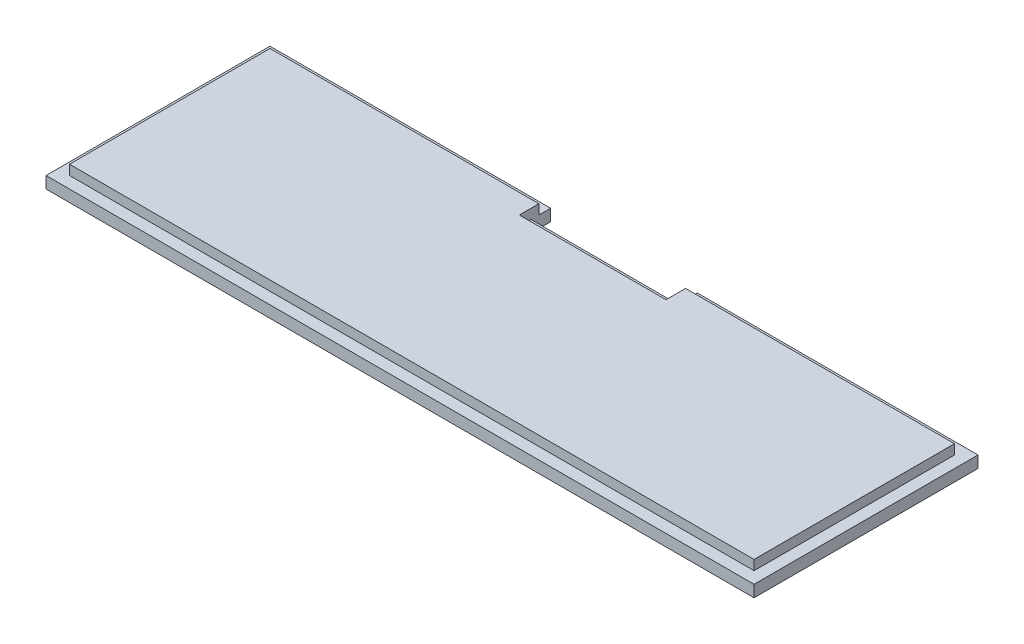
ISO-10303-21;
HEADER;
FILE_DESCRIPTION(('STEP AP214'),'2;1');
FILE_NAME('part.step','',(''),(''),'','','');
FILE_SCHEMA(('AUTOMOTIVE_DESIGN { 1 0 10303 214 1 1 1 1 }'));
ENDSEC;
DATA;
#1=APPLICATION_CONTEXT('core data for automotive mechanical design processes');
#2=APPLICATION_PROTOCOL_DEFINITION('international standard','automotive_design',2000,#1);
#3=PRODUCT_CONTEXT('',#1,'mechanical');
#4=PRODUCT('Part','Part','',(#3));
#5=PRODUCT_RELATED_PRODUCT_CATEGORY('part','',(#4));
#6=PRODUCT_DEFINITION_FORMATION('','',#4);
#7=PRODUCT_DEFINITION_CONTEXT('part definition',#1,'design');
#8=PRODUCT_DEFINITION('design','',#6,#7);
#9=PRODUCT_DEFINITION_SHAPE('','',#8);
#10=(LENGTH_UNIT() NAMED_UNIT(*) SI_UNIT(.MILLI.,.METRE.));
#11=(NAMED_UNIT(*) PLANE_ANGLE_UNIT() SI_UNIT($,.RADIAN.));
#12=(NAMED_UNIT(*) SI_UNIT($,.STERADIAN.) SOLID_ANGLE_UNIT());
#13=UNCERTAINTY_MEASURE_WITH_UNIT(LENGTH_MEASURE(1.E-05),#10,'distance_accuracy_value','');
#14=(GEOMETRIC_REPRESENTATION_CONTEXT(3) GLOBAL_UNCERTAINTY_ASSIGNED_CONTEXT((#13)) GLOBAL_UNIT_ASSIGNED_CONTEXT((#10,
#11,#12)) REPRESENTATION_CONTEXT('',''));
#15=CARTESIAN_POINT('',(0.,0.,0.));
#16=DIRECTION('',(0.,0.,1.));
#17=DIRECTION('',(1.,0.,0.));
#18=AXIS2_PLACEMENT_3D('',#15,#16,#17);
#19=CARTESIAN_POINT('',(28.7,-7.8,-20.9));
#20=DIRECTION('',(0.,0.,1.));
#21=DIRECTION('',(1.,0.,0.));
#22=AXIS2_PLACEMENT_3D('',#19,#20,#21);
#23=PLANE('',#22);
#24=DIRECTION('',(-1.,0.,0.));
#25=VECTOR('',#24,1.);
#26=CARTESIAN_POINT('',(28.7,1.2,-20.9));
#27=LINE('',#26,#25);
#28=CARTESIAN_POINT('',(43.7,1.2,-20.9));
#29=VERTEX_POINT('',#28);
#30=CARTESIAN_POINT('',(28.7,1.2,-20.9));
#31=VERTEX_POINT('',#30);
#32=EDGE_CURVE('E166',#29,#31,#27,.T.);
#33=ORIENTED_EDGE('',*,*,#32,.F.);
#34=DIRECTION('',(0.,1.,0.));
#35=VECTOR('',#34,1.);
#36=CARTESIAN_POINT('',(43.7,-7.8,-20.9));
#37=LINE('',#36,#35);
#38=CARTESIAN_POINT('',(43.7,0.,-20.9));
#39=VERTEX_POINT('',#38);
#40=EDGE_CURVE('E199',#39,#29,#37,.T.);
#41=ORIENTED_EDGE('',*,*,#40,.F.);
#42=DIRECTION('',(-1.,0.,0.));
#43=VECTOR('',#42,1.);
#44=CARTESIAN_POINT('',(0.,0.,-20.9));
#45=LINE('',#44,#43);
#46=CARTESIAN_POINT('',(28.7,0.,-20.9));
#47=VERTEX_POINT('',#46);
#48=EDGE_CURVE('E194',#39,#47,#45,.T.);
#49=ORIENTED_EDGE('',*,*,#48,.T.);
#50=DIRECTION('',(0.,1.,0.));
#51=VECTOR('',#50,1.);
#52=CARTESIAN_POINT('',(28.7,-7.8,-20.9));
#53=LINE('',#52,#51);
#54=EDGE_CURVE('E190',#47,#31,#53,.T.);
#55=ORIENTED_EDGE('',*,*,#54,.T.);
#56=EDGE_LOOP('',(#33,#41,#49,#55));
#57=FACE_BOUND('',#56,.T.);
#58=ADVANCED_FACE('F38',(#57),#23,.F.);
#59=CARTESIAN_POINT('',(0.,1.2,-22.9));
#60=DIRECTION('',(0.,0.,1.));
#61=DIRECTION('',(1.,0.,0.));
#62=AXIS2_PLACEMENT_3D('',#59,#60,#61);
#63=PLANE('',#62);
#64=DIRECTION('',(-1.,0.,0.));
#65=VECTOR('',#64,1.);
#66=CARTESIAN_POINT('',(0.,1.2,-22.9));
#67=LINE('',#66,#65);
#68=CARTESIAN_POINT('',(28.7,1.2,-22.9));
#69=VERTEX_POINT('',#68);
#70=CARTESIAN_POINT('',(0.,1.2,-22.9));
#71=VERTEX_POINT('',#70);
#72=EDGE_CURVE('E287',#69,#71,#67,.T.);
#73=ORIENTED_EDGE('',*,*,#72,.F.);
#74=DIRECTION('',(0.,1.,0.));
#75=VECTOR('',#74,1.);
#76=CARTESIAN_POINT('',(28.7,-7.8,-22.9));
#77=LINE('',#76,#75);
#78=CARTESIAN_POINT('',(28.7,0.,-22.9));
#79=VERTEX_POINT('',#78);
#80=EDGE_CURVE('E191',#79,#69,#77,.T.);
#81=ORIENTED_EDGE('',*,*,#80,.F.);
#82=DIRECTION('',(-1.,0.,0.));
#83=VECTOR('',#82,1.);
#84=CARTESIAN_POINT('',(0.,0.,-22.9));
#85=LINE('',#84,#83);
#86=CARTESIAN_POINT('',(0.,0.,-22.9));
#87=VERTEX_POINT('',#86);
#88=EDGE_CURVE('E302',#79,#87,#85,.T.);
#89=ORIENTED_EDGE('',*,*,#88,.T.);
#90=DIRECTION('',(0.,-1.,0.));
#91=VECTOR('',#90,1.);
#92=CARTESIAN_POINT('',(0.,1.2,-22.9));
#93=LINE('',#92,#91);
#94=EDGE_CURVE('E292',#71,#87,#93,.T.);
#95=ORIENTED_EDGE('',*,*,#94,.F.);
#96=EDGE_LOOP('',(#73,#81,#89,#95));
#97=FACE_BOUND('',#96,.T.);
#98=ADVANCED_FACE('F346',(#97),#63,.F.);
#99=CARTESIAN_POINT('',(1.2,2.2,-21.7));
#100=DIRECTION('',(0.,0.,1.));
#101=DIRECTION('',(1.,0.,0.));
#102=AXIS2_PLACEMENT_3D('',#99,#100,#101);
#103=PLANE('',#102);
#104=DIRECTION('',(-1.,0.,0.));
#105=VECTOR('',#104,1.);
#106=CARTESIAN_POINT('',(1.2,2.2,-21.7));
#107=LINE('',#106,#105);
#108=CARTESIAN_POINT('',(28.7,2.2,-21.7));
#109=VERTEX_POINT('',#108);
#110=CARTESIAN_POINT('',(1.2,2.2,-21.7));
#111=VERTEX_POINT('',#110);
#112=EDGE_CURVE('E240',#109,#111,#107,.T.);
#113=ORIENTED_EDGE('',*,*,#112,.F.);
#114=DIRECTION('',(0.,-1.,0.));
#115=VECTOR('',#114,1.);
#116=CARTESIAN_POINT('',(28.7,2.2,-21.7));
#117=LINE('',#116,#115);
#118=CARTESIAN_POINT('',(28.7,1.2,-21.7));
#119=VERTEX_POINT('',#118);
#120=EDGE_CURVE('E218',#109,#119,#117,.T.);
#121=ORIENTED_EDGE('',*,*,#120,.T.);
#122=DIRECTION('',(-1.,0.,0.));
#123=VECTOR('',#122,1.);
#124=CARTESIAN_POINT('',(1.2,1.2,-21.7));
#125=LINE('',#124,#123);
#126=CARTESIAN_POINT('',(1.2,1.2,-21.7));
#127=VERTEX_POINT('',#126);
#128=EDGE_CURVE('E62',#119,#127,#125,.T.);
#129=ORIENTED_EDGE('',*,*,#128,.T.);
#130=DIRECTION('',(0.,-1.,0.));
#131=VECTOR('',#130,1.);
#132=CARTESIAN_POINT('',(1.2,2.2,-21.7));
#133=LINE('',#132,#131);
#134=EDGE_CURVE('E245',#111,#127,#133,.T.);
#135=ORIENTED_EDGE('',*,*,#134,.F.);
#136=EDGE_LOOP('',(#113,#121,#129,#135));
#137=FACE_BOUND('',#136,.T.);
#138=ADVANCED_FACE('F355',(#137),#103,.F.);
#139=CARTESIAN_POINT('',(0.,1.2,0.));
#140=DIRECTION('',(0.,-1.,0.));
#141=DIRECTION('',(0.,0.,-1.));
#142=AXIS2_PLACEMENT_3D('',#139,#140,#141);
#143=PLANE('',#142);
#144=ORIENTED_EDGE('',*,*,#128,.F.);
#145=DIRECTION('',(0.,0.,-1.));
#146=VECTOR('',#145,1.);
#147=CARTESIAN_POINT('',(28.7,1.2,0.));
#148=LINE('',#147,#146);
#149=EDGE_CURVE('E221',#119,#69,#148,.T.);
#150=ORIENTED_EDGE('',*,*,#149,.T.);
#151=ORIENTED_EDGE('',*,*,#72,.T.);
#152=DIRECTION('',(0.,0.,1.));
#153=VECTOR('',#152,1.);
#154=CARTESIAN_POINT('',(0.,1.2,0.));
#155=LINE('',#154,#153);
#156=CARTESIAN_POINT('',(0.,1.2,0.));
#157=VERTEX_POINT('',#156);
#158=EDGE_CURVE('E276',#71,#157,#155,.T.);
#159=ORIENTED_EDGE('',*,*,#158,.T.);
#160=DIRECTION('',(1.,0.,0.));
#161=VECTOR('',#160,1.);
#162=CARTESIAN_POINT('',(0.,1.2,0.));
#163=LINE('',#162,#161);
#164=CARTESIAN_POINT('',(72.4,1.2,0.));
#165=VERTEX_POINT('',#164);
#166=EDGE_CURVE('E280',#157,#165,#163,.T.);
#167=ORIENTED_EDGE('',*,*,#166,.T.);
#168=DIRECTION('',(0.,0.,-1.));
#169=VECTOR('',#168,1.);
#170=CARTESIAN_POINT('',(72.4,1.2,0.));
#171=LINE('',#170,#169);
#172=CARTESIAN_POINT('',(72.4,1.2,-22.9));
#173=VERTEX_POINT('',#172);
#174=EDGE_CURVE('E284',#165,#173,#171,.T.);
#175=ORIENTED_EDGE('',*,*,#174,.T.);
#176=CARTESIAN_POINT('',(43.7,1.2,-22.9));
#177=VERTEX_POINT('',#176);
#178=EDGE_CURVE('E288',#173,#177,#67,.T.);
#179=ORIENTED_EDGE('',*,*,#178,.T.);
#180=DIRECTION('',(0.,0.,1.));
#181=VECTOR('',#180,1.);
#182=CARTESIAN_POINT('',(43.7,1.2,0.));
#183=LINE('',#182,#181);
#184=CARTESIAN_POINT('',(43.7,1.2,-21.7));
#185=VERTEX_POINT('',#184);
#186=EDGE_CURVE('E211',#177,#185,#183,.T.);
#187=ORIENTED_EDGE('',*,*,#186,.T.);
#188=CARTESIAN_POINT('',(71.2,1.2,-21.7));
#189=VERTEX_POINT('',#188);
#190=EDGE_CURVE('E234',#189,#185,#125,.T.);
#191=ORIENTED_EDGE('',*,*,#190,.F.);
#192=DIRECTION('',(0.,0.,-1.));
#193=VECTOR('',#192,1.);
#194=CARTESIAN_POINT('',(71.2,1.2,-21.7));
#195=LINE('',#194,#193);
#196=CARTESIAN_POINT('',(71.2,1.2,-1.2));
#197=VERTEX_POINT('',#196);
#198=EDGE_CURVE('E253',#197,#189,#195,.T.);
#199=ORIENTED_EDGE('',*,*,#198,.F.);
#200=DIRECTION('',(1.,0.,0.));
#201=VECTOR('',#200,1.);
#202=CARTESIAN_POINT('',(1.2,1.2,-1.2));
#203=LINE('',#202,#201);
#204=CARTESIAN_POINT('',(1.2,1.2,-1.2));
#205=VERTEX_POINT('',#204);
#206=EDGE_CURVE('E249',#205,#197,#203,.T.);
#207=ORIENTED_EDGE('',*,*,#206,.F.);
#208=DIRECTION('',(0.,0.,1.));
#209=VECTOR('',#208,1.);
#210=CARTESIAN_POINT('',(1.2,1.2,-21.7));
#211=LINE('',#210,#209);
#212=EDGE_CURVE('E228',#127,#205,#211,.T.);
#213=ORIENTED_EDGE('',*,*,#212,.F.);
#214=EDGE_LOOP('',(#144,#150,#151,#159,#167,#175,#179,#187,#191,#199,#207,#213));
#215=FACE_BOUND('',#214,.T.);
#216=ADVANCED_FACE('F341',(#215),#143,.F.);
#217=CARTESIAN_POINT('',(0.,1.2,0.));
#218=DIRECTION('',(1.,0.,0.));
#219=DIRECTION('',(0.,0.,-1.));
#220=AXIS2_PLACEMENT_3D('',#217,#218,#219);
#221=PLANE('',#220);
#222=DIRECTION('',(0.,0.,1.));
#223=VECTOR('',#222,1.);
#224=CARTESIAN_POINT('',(0.,0.,0.));
#225=LINE('',#224,#223);
#226=CARTESIAN_POINT('',(0.,0.,0.));
#227=VERTEX_POINT('',#226);
#228=EDGE_CURVE('E275',#87,#227,#225,.T.);
#229=ORIENTED_EDGE('',*,*,#228,.T.);
#230=DIRECTION('',(0.,-1.,0.));
#231=VECTOR('',#230,1.);
#232=CARTESIAN_POINT('',(0.,1.2,0.));
#233=LINE('',#232,#231);
#234=EDGE_CURVE('E47',#157,#227,#233,.T.);
#235=ORIENTED_EDGE('',*,*,#234,.F.);
#236=ORIENTED_EDGE('',*,*,#158,.F.);
#237=ORIENTED_EDGE('',*,*,#94,.T.);
#238=EDGE_LOOP('',(#229,#235,#236,#237));
#239=FACE_BOUND('',#238,.T.);
#240=ADVANCED_FACE('F40',(#239),#221,.F.);
#241=CARTESIAN_POINT('',(0.,1.2,0.));
#242=DIRECTION('',(0.,0.,-1.));
#243=DIRECTION('',(-1.,0.,0.));
#244=AXIS2_PLACEMENT_3D('',#241,#242,#243);
#245=PLANE('',#244);
#246=DIRECTION('',(1.,0.,0.));
#247=VECTOR('',#246,1.);
#248=CARTESIAN_POINT('',(0.,0.,0.));
#249=LINE('',#248,#247);
#250=CARTESIAN_POINT('',(72.4,0.,0.));
#251=VERTEX_POINT('',#250);
#252=EDGE_CURVE('E296',#227,#251,#249,.T.);
#253=ORIENTED_EDGE('',*,*,#252,.T.);
#254=DIRECTION('',(0.,-1.,0.));
#255=VECTOR('',#254,1.);
#256=CARTESIAN_POINT('',(72.4,1.2,0.));
#257=LINE('',#256,#255);
#258=EDGE_CURVE('E313',#165,#251,#257,.T.);
#259=ORIENTED_EDGE('',*,*,#258,.F.);
#260=ORIENTED_EDGE('',*,*,#166,.F.);
#261=ORIENTED_EDGE('',*,*,#234,.T.);
#262=EDGE_LOOP('',(#253,#259,#260,#261));
#263=FACE_BOUND('',#262,.T.);
#264=ADVANCED_FACE('F320',(#263),#245,.F.);
#265=CARTESIAN_POINT('',(72.4,1.2,0.));
#266=DIRECTION('',(-1.,0.,0.));
#267=DIRECTION('',(0.,0.,1.));
#268=AXIS2_PLACEMENT_3D('',#265,#266,#267);
#269=PLANE('',#268);
#270=DIRECTION('',(0.,0.,-1.));
#271=VECTOR('',#270,1.);
#272=CARTESIAN_POINT('',(72.4,0.,0.));
#273=LINE('',#272,#271);
#274=CARTESIAN_POINT('',(72.4,0.,-22.9));
#275=VERTEX_POINT('',#274);
#276=EDGE_CURVE('E299',#251,#275,#273,.T.);
#277=ORIENTED_EDGE('',*,*,#276,.T.);
#278=DIRECTION('',(0.,-1.,0.));
#279=VECTOR('',#278,1.);
#280=CARTESIAN_POINT('',(72.4,1.2,-22.9));
#281=LINE('',#280,#279);
#282=EDGE_CURVE('E309',#173,#275,#281,.T.);
#283=ORIENTED_EDGE('',*,*,#282,.F.);
#284=ORIENTED_EDGE('',*,*,#174,.F.);
#285=ORIENTED_EDGE('',*,*,#258,.T.);
#286=EDGE_LOOP('',(#277,#283,#284,#285));
#287=FACE_BOUND('',#286,.T.);
#288=ADVANCED_FACE('F335',(#287),#269,.F.);
#289=CARTESIAN_POINT('',(43.7,0.,-22.9));
#290=VERTEX_POINT('',#289);
#291=EDGE_CURVE('E281',#275,#290,#85,.T.);
#292=ORIENTED_EDGE('',*,*,#291,.T.);
#293=DIRECTION('',(0.,1.,0.));
#294=VECTOR('',#293,1.);
#295=CARTESIAN_POINT('',(43.7,-7.8,-22.9));
#296=LINE('',#295,#294);
#297=EDGE_CURVE('E195',#290,#177,#296,.T.);
#298=ORIENTED_EDGE('',*,*,#297,.T.);
#299=ORIENTED_EDGE('',*,*,#178,.F.);
#300=ORIENTED_EDGE('',*,*,#282,.T.);
#301=EDGE_LOOP('',(#292,#298,#299,#300));
#302=FACE_BOUND('',#301,.T.);
#303=ADVANCED_FACE('F339',(#302),#63,.F.);
#304=CARTESIAN_POINT('',(0.,0.,0.));
#305=DIRECTION('',(0.,-1.,0.));
#306=DIRECTION('',(0.,0.,-1.));
#307=AXIS2_PLACEMENT_3D('',#304,#305,#306);
#308=PLANE('',#307);
#309=DIRECTION('',(0.,0.,-1.));
#310=VECTOR('',#309,1.);
#311=CARTESIAN_POINT('',(28.7,0.,0.));
#312=LINE('',#311,#310);
#313=EDGE_CURVE('E225',#47,#79,#312,.T.);
#314=ORIENTED_EDGE('',*,*,#313,.F.);
#315=ORIENTED_EDGE('',*,*,#48,.F.);
#316=DIRECTION('',(0.,0.,1.));
#317=VECTOR('',#316,1.);
#318=CARTESIAN_POINT('',(43.7,0.,0.));
#319=LINE('',#318,#317);
#320=EDGE_CURVE('E215',#290,#39,#319,.T.);
#321=ORIENTED_EDGE('',*,*,#320,.F.);
#322=ORIENTED_EDGE('',*,*,#291,.F.);
#323=ORIENTED_EDGE('',*,*,#276,.F.);
#324=ORIENTED_EDGE('',*,*,#252,.F.);
#325=ORIENTED_EDGE('',*,*,#228,.F.);
#326=ORIENTED_EDGE('',*,*,#88,.F.);
#327=EDGE_LOOP('',(#314,#315,#321,#322,#323,#324,#325,#326));
#328=FACE_BOUND('',#327,.T.);
#329=ADVANCED_FACE('F329',(#328),#308,.T.);
#330=CARTESIAN_POINT('',(1.2,2.2,-21.7));
#331=DIRECTION('',(1.,0.,0.));
#332=DIRECTION('',(0.,0.,-1.));
#333=AXIS2_PLACEMENT_3D('',#330,#331,#332);
#334=PLANE('',#333);
#335=ORIENTED_EDGE('',*,*,#212,.T.);
#336=DIRECTION('',(0.,-1.,0.));
#337=VECTOR('',#336,1.);
#338=CARTESIAN_POINT('',(1.2,2.2,-1.2));
#339=LINE('',#338,#337);
#340=CARTESIAN_POINT('',(1.2,2.2,-1.2));
#341=VERTEX_POINT('',#340);
#342=EDGE_CURVE('E271',#341,#205,#339,.T.);
#343=ORIENTED_EDGE('',*,*,#342,.F.);
#344=DIRECTION('',(0.,0.,1.));
#345=VECTOR('',#344,1.);
#346=CARTESIAN_POINT('',(1.2,2.2,-21.7));
#347=LINE('',#346,#345);
#348=EDGE_CURVE('E229',#111,#341,#347,.T.);
#349=ORIENTED_EDGE('',*,*,#348,.F.);
#350=ORIENTED_EDGE('',*,*,#134,.T.);
#351=EDGE_LOOP('',(#335,#343,#349,#350));
#352=FACE_BOUND('',#351,.T.);
#353=ADVANCED_FACE('F357',(#352),#334,.F.);
#354=CARTESIAN_POINT('',(1.2,2.2,-1.2));
#355=DIRECTION('',(0.,0.,-1.));
#356=DIRECTION('',(-1.,0.,0.));
#357=AXIS2_PLACEMENT_3D('',#354,#355,#356);
#358=PLANE('',#357);
#359=ORIENTED_EDGE('',*,*,#206,.T.);
#360=DIRECTION('',(0.,-1.,0.));
#361=VECTOR('',#360,1.);
#362=CARTESIAN_POINT('',(71.2,2.2,-1.2));
#363=LINE('',#362,#361);
#364=CARTESIAN_POINT('',(71.2,2.2,-1.2));
#365=VERTEX_POINT('',#364);
#366=EDGE_CURVE('E267',#365,#197,#363,.T.);
#367=ORIENTED_EDGE('',*,*,#366,.F.);
#368=DIRECTION('',(1.,0.,0.));
#369=VECTOR('',#368,1.);
#370=CARTESIAN_POINT('',(1.2,2.2,-1.2));
#371=LINE('',#370,#369);
#372=EDGE_CURVE('E233',#341,#365,#371,.T.);
#373=ORIENTED_EDGE('',*,*,#372,.F.);
#374=ORIENTED_EDGE('',*,*,#342,.T.);
#375=EDGE_LOOP('',(#359,#367,#373,#374));
#376=FACE_BOUND('',#375,.T.);
#377=ADVANCED_FACE('F359',(#376),#358,.F.);
#378=CARTESIAN_POINT('',(71.2,2.2,-21.7));
#379=DIRECTION('',(-1.,0.,0.));
#380=DIRECTION('',(0.,0.,1.));
#381=AXIS2_PLACEMENT_3D('',#378,#379,#380);
#382=PLANE('',#381);
#383=ORIENTED_EDGE('',*,*,#198,.T.);
#384=DIRECTION('',(0.,-1.,0.));
#385=VECTOR('',#384,1.);
#386=CARTESIAN_POINT('',(71.2,2.2,-21.7));
#387=LINE('',#386,#385);
#388=CARTESIAN_POINT('',(71.2,2.2,-21.7));
#389=VERTEX_POINT('',#388);
#390=EDGE_CURVE('E263',#389,#189,#387,.T.);
#391=ORIENTED_EDGE('',*,*,#390,.F.);
#392=DIRECTION('',(0.,0.,-1.));
#393=VECTOR('',#392,1.);
#394=CARTESIAN_POINT('',(71.2,2.2,-21.7));
#395=LINE('',#394,#393);
#396=EDGE_CURVE('E237',#365,#389,#395,.T.);
#397=ORIENTED_EDGE('',*,*,#396,.F.);
#398=ORIENTED_EDGE('',*,*,#366,.T.);
#399=EDGE_LOOP('',(#383,#391,#397,#398));
#400=FACE_BOUND('',#399,.T.);
#401=ADVANCED_FACE('F365',(#400),#382,.F.);
#402=ORIENTED_EDGE('',*,*,#190,.T.);
#403=DIRECTION('',(0.,1.,0.));
#404=VECTOR('',#403,1.);
#405=CARTESIAN_POINT('',(43.7,2.2,-21.7));
#406=LINE('',#405,#404);
#407=CARTESIAN_POINT('',(43.7,2.2,-21.7));
#408=VERTEX_POINT('',#407);
#409=EDGE_CURVE('E207',#185,#408,#406,.T.);
#410=ORIENTED_EDGE('',*,*,#409,.T.);
#411=EDGE_CURVE('E241',#389,#408,#107,.T.);
#412=ORIENTED_EDGE('',*,*,#411,.F.);
#413=ORIENTED_EDGE('',*,*,#390,.T.);
#414=EDGE_LOOP('',(#402,#410,#412,#413));
#415=FACE_BOUND('',#414,.T.);
#416=ADVANCED_FACE('F367',(#415),#103,.F.);
#417=CARTESIAN_POINT('',(0.,2.2,0.));
#418=DIRECTION('',(0.,1.,0.));
#419=DIRECTION('',(0.,0.,1.));
#420=AXIS2_PLACEMENT_3D('',#417,#418,#419);
#421=PLANE('',#420);
#422=DIRECTION('',(1.,0.,0.));
#423=VECTOR('',#422,1.);
#424=CARTESIAN_POINT('',(28.7,2.2,-19.7));
#425=LINE('',#424,#423);
#426=CARTESIAN_POINT('',(28.7,2.2,-19.7));
#427=VERTEX_POINT('',#426);
#428=CARTESIAN_POINT('',(43.7,2.2,-19.7));
#429=VERTEX_POINT('',#428);
#430=EDGE_CURVE('E176',#427,#429,#425,.T.);
#431=ORIENTED_EDGE('',*,*,#430,.F.);
#432=DIRECTION('',(0.,0.,1.));
#433=VECTOR('',#432,1.);
#434=CARTESIAN_POINT('',(28.7,2.2,0.));
#435=LINE('',#434,#433);
#436=EDGE_CURVE('E11',#109,#427,#435,.T.);
#437=ORIENTED_EDGE('',*,*,#436,.F.);
#438=ORIENTED_EDGE('',*,*,#112,.T.);
#439=ORIENTED_EDGE('',*,*,#348,.T.);
#440=ORIENTED_EDGE('',*,*,#372,.T.);
#441=ORIENTED_EDGE('',*,*,#396,.T.);
#442=ORIENTED_EDGE('',*,*,#411,.T.);
#443=DIRECTION('',(0.,0.,-1.));
#444=VECTOR('',#443,1.);
#445=CARTESIAN_POINT('',(43.7,2.2,-22.9));
#446=LINE('',#445,#444);
#447=EDGE_CURVE('E186',#429,#408,#446,.T.);
#448=ORIENTED_EDGE('',*,*,#447,.F.);
#449=EDGE_LOOP('',(#431,#437,#438,#439,#440,#441,#442,#448));
#450=FACE_BOUND('',#449,.T.);
#451=ADVANCED_FACE('F352',(#450),#421,.T.);
#452=CARTESIAN_POINT('',(28.7,-7.8,-22.9));
#453=DIRECTION('',(-1.,0.,0.));
#454=DIRECTION('',(0.,0.,1.));
#455=AXIS2_PLACEMENT_3D('',#452,#453,#454);
#456=PLANE('',#455);
#457=ORIENTED_EDGE('',*,*,#313,.T.);
#458=ORIENTED_EDGE('',*,*,#80,.T.);
#459=ORIENTED_EDGE('',*,*,#149,.F.);
#460=ORIENTED_EDGE('',*,*,#120,.F.);
#461=ORIENTED_EDGE('',*,*,#436,.T.);
#462=DIRECTION('',(0.,1.,0.));
#463=VECTOR('',#462,1.);
#464=CARTESIAN_POINT('',(28.7,1.2,-19.7));
#465=LINE('',#464,#463);
#466=CARTESIAN_POINT('',(28.7,1.2,-19.7));
#467=VERTEX_POINT('',#466);
#468=EDGE_CURVE('E154',#467,#427,#465,.T.);
#469=ORIENTED_EDGE('',*,*,#468,.F.);
#470=DIRECTION('',(0.,0.,1.));
#471=VECTOR('',#470,1.);
#472=CARTESIAN_POINT('',(28.7,1.2,-20.9));
#473=LINE('',#472,#471);
#474=EDGE_CURVE('E159',#31,#467,#473,.T.);
#475=ORIENTED_EDGE('',*,*,#474,.F.);
#476=ORIENTED_EDGE('',*,*,#54,.F.);
#477=EDGE_LOOP('',(#457,#458,#459,#460,#461,#469,#475,#476));
#478=FACE_BOUND('',#477,.T.);
#479=ADVANCED_FACE('F156',(#478),#456,.F.);
#480=CARTESIAN_POINT('',(43.7,-7.8,-22.9));
#481=DIRECTION('',(1.,0.,0.));
#482=DIRECTION('',(0.,0.,-1.));
#483=AXIS2_PLACEMENT_3D('',#480,#481,#482);
#484=PLANE('',#483);
#485=ORIENTED_EDGE('',*,*,#320,.T.);
#486=ORIENTED_EDGE('',*,*,#40,.T.);
#487=DIRECTION('',(0.,0.,-1.));
#488=VECTOR('',#487,1.);
#489=CARTESIAN_POINT('',(43.7,1.2,-20.9));
#490=LINE('',#489,#488);
#491=CARTESIAN_POINT('',(43.7,1.2,-19.7));
#492=VERTEX_POINT('',#491);
#493=EDGE_CURVE('E54',#492,#29,#490,.T.);
#494=ORIENTED_EDGE('',*,*,#493,.F.);
#495=DIRECTION('',(0.,1.,0.));
#496=VECTOR('',#495,1.);
#497=CARTESIAN_POINT('',(43.7,1.2,-19.7));
#498=LINE('',#497,#496);
#499=EDGE_CURVE('E165',#492,#429,#498,.T.);
#500=ORIENTED_EDGE('',*,*,#499,.T.);
#501=ORIENTED_EDGE('',*,*,#447,.T.);
#502=ORIENTED_EDGE('',*,*,#409,.F.);
#503=ORIENTED_EDGE('',*,*,#186,.F.);
#504=ORIENTED_EDGE('',*,*,#297,.F.);
#505=EDGE_LOOP('',(#485,#486,#494,#500,#501,#502,#503,#504));
#506=FACE_BOUND('',#505,.T.);
#507=ADVANCED_FACE('F369',(#506),#484,.F.);
#508=CARTESIAN_POINT('',(28.7,1.2,-19.7));
#509=DIRECTION('',(0.,0.,1.));
#510=DIRECTION('',(1.,0.,0.));
#511=AXIS2_PLACEMENT_3D('',#508,#509,#510);
#512=PLANE('',#511);
#513=ORIENTED_EDGE('',*,*,#430,.T.);
#514=ORIENTED_EDGE('',*,*,#499,.F.);
#515=DIRECTION('',(1.,0.,0.));
#516=VECTOR('',#515,1.);
#517=CARTESIAN_POINT('',(28.7,1.2,-19.7));
#518=LINE('',#517,#516);
#519=EDGE_CURVE('E168',#467,#492,#518,.T.);
#520=ORIENTED_EDGE('',*,*,#519,.F.);
#521=ORIENTED_EDGE('',*,*,#468,.T.);
#522=EDGE_LOOP('',(#513,#514,#520,#521));
#523=FACE_BOUND('',#522,.T.);
#524=ADVANCED_FACE('F169',(#523),#512,.F.);
#525=CARTESIAN_POINT('',(0.,1.2,0.));
#526=DIRECTION('',(0.,1.,0.));
#527=DIRECTION('',(0.,0.,1.));
#528=AXIS2_PLACEMENT_3D('',#525,#526,#527);
#529=PLANE('',#528);
#530=ORIENTED_EDGE('',*,*,#474,.T.);
#531=ORIENTED_EDGE('',*,*,#519,.T.);
#532=ORIENTED_EDGE('',*,*,#493,.T.);
#533=ORIENTED_EDGE('',*,*,#32,.T.);
#534=EDGE_LOOP('',(#530,#531,#532,#533));
#535=FACE_BOUND('',#534,.T.);
#536=ADVANCED_FACE('F173',(#535),#529,.T.);
#537=CLOSED_SHELL('',(#58,#98,#138,#216,#240,#264,#288,#303,#329,#353,#377,#401,#416,#451,#479,
#507,#524,#536));
#538=MANIFOLD_SOLID_BREP('B2',#537);
#539=ADVANCED_BREP_SHAPE_REPRESENTATION('',(#18,#538),#14);
#540=SHAPE_DEFINITION_REPRESENTATION(#9,#539);
ENDSEC;
END-ISO-10303-21;
